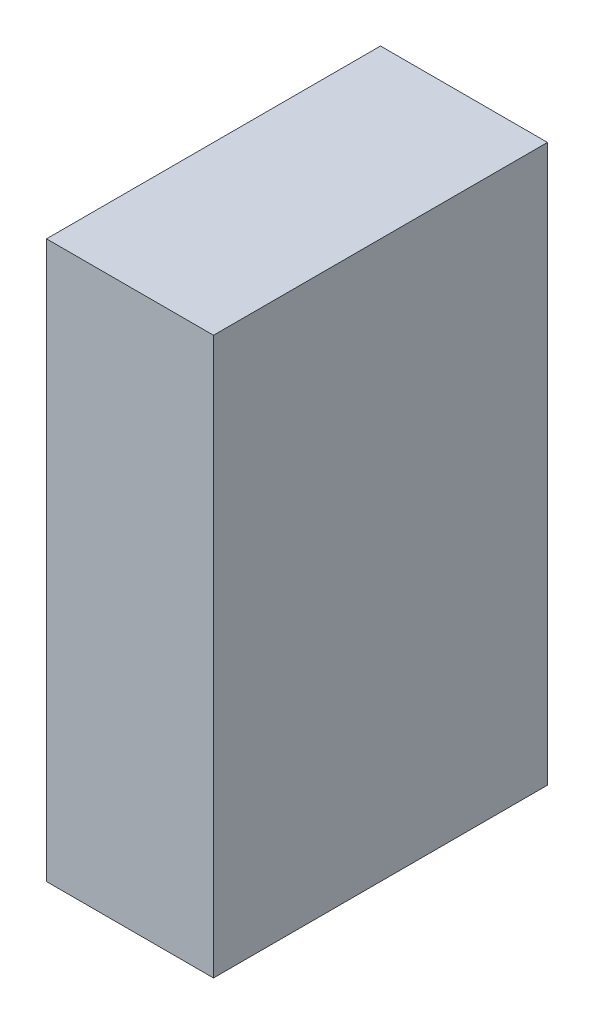
ISO-10303-21;
HEADER;
FILE_DESCRIPTION(('STEP AP214'),'2;1');
FILE_NAME('part.step','',(''),(''),'','','');
FILE_SCHEMA(('AUTOMOTIVE_DESIGN { 1 0 10303 214 1 1 1 1 }'));
ENDSEC;
DATA;
#1=APPLICATION_CONTEXT('core data for automotive mechanical design processes');
#2=APPLICATION_PROTOCOL_DEFINITION('international standard','automotive_design',2000,#1);
#3=PRODUCT_CONTEXT('',#1,'mechanical');
#4=PRODUCT('Part','Part','',(#3));
#5=PRODUCT_RELATED_PRODUCT_CATEGORY('part','',(#4));
#6=PRODUCT_DEFINITION_FORMATION('','',#4);
#7=PRODUCT_DEFINITION_CONTEXT('part definition',#1,'design');
#8=PRODUCT_DEFINITION('design','',#6,#7);
#9=PRODUCT_DEFINITION_SHAPE('','',#8);
#10=(LENGTH_UNIT() NAMED_UNIT(*) SI_UNIT(.MILLI.,.METRE.));
#11=(NAMED_UNIT(*) PLANE_ANGLE_UNIT() SI_UNIT($,.RADIAN.));
#12=(NAMED_UNIT(*) SI_UNIT($,.STERADIAN.) SOLID_ANGLE_UNIT());
#13=UNCERTAINTY_MEASURE_WITH_UNIT(LENGTH_MEASURE(1.E-05),#10,'distance_accuracy_value','');
#14=(GEOMETRIC_REPRESENTATION_CONTEXT(3) GLOBAL_UNCERTAINTY_ASSIGNED_CONTEXT((#13)) GLOBAL_UNIT_ASSIGNED_CONTEXT((#10,
#11,#12)) REPRESENTATION_CONTEXT('',''));
#15=CARTESIAN_POINT('',(0.,0.,0.));
#16=DIRECTION('',(0.,0.,1.));
#17=DIRECTION('',(1.,0.,0.));
#18=AXIS2_PLACEMENT_3D('',#15,#16,#17);
#19=CARTESIAN_POINT('',(-3.,10.,12.));
#20=DIRECTION('',(1.,0.,0.));
#21=DIRECTION('',(0.,0.,-1.));
#22=AXIS2_PLACEMENT_3D('',#19,#20,#21);
#23=PLANE('',#22);
#24=DIRECTION('',(0.,-1.,0.));
#25=VECTOR('',#24,1.);
#26=CARTESIAN_POINT('',(-3.,10.,0.));
#27=LINE('',#26,#25);
#28=CARTESIAN_POINT('',(-3.,10.,0.));
#29=VERTEX_POINT('',#28);
#30=CARTESIAN_POINT('',(-3.,-10.,0.));
#31=VERTEX_POINT('',#30);
#32=EDGE_CURVE('E96',#29,#31,#27,.T.);
#33=ORIENTED_EDGE('',*,*,#32,.T.);
#34=DIRECTION('',(0.,0.,-1.));
#35=VECTOR('',#34,1.);
#36=CARTESIAN_POINT('',(-3.,-10.,12.));
#37=LINE('',#36,#35);
#38=CARTESIAN_POINT('',(-3.,-10.,12.));
#39=VERTEX_POINT('',#38);
#40=EDGE_CURVE('E11',#39,#31,#37,.T.);
#41=ORIENTED_EDGE('',*,*,#40,.F.);
#42=DIRECTION('',(0.,-1.,0.));
#43=VECTOR('',#42,1.);
#44=CARTESIAN_POINT('',(-3.,10.,12.));
#45=LINE('',#44,#43);
#46=CARTESIAN_POINT('',(-3.,10.,12.));
#47=VERTEX_POINT('',#46);
#48=EDGE_CURVE('E84',#47,#39,#45,.T.);
#49=ORIENTED_EDGE('',*,*,#48,.F.);
#50=DIRECTION('',(0.,0.,-1.));
#51=VECTOR('',#50,1.);
#52=CARTESIAN_POINT('',(-3.,10.,12.));
#53=LINE('',#52,#51);
#54=EDGE_CURVE('E92',#47,#29,#53,.T.);
#55=ORIENTED_EDGE('',*,*,#54,.T.);
#56=EDGE_LOOP('',(#33,#41,#49,#55));
#57=FACE_BOUND('',#56,.T.);
#58=ADVANCED_FACE('F33',(#57),#23,.F.);
#59=CARTESIAN_POINT('',(-3.,-10.,12.));
#60=DIRECTION('',(0.,1.,0.));
#61=DIRECTION('',(0.,0.,1.));
#62=AXIS2_PLACEMENT_3D('',#59,#60,#61);
#63=PLANE('',#62);
#64=DIRECTION('',(1.,0.,0.));
#65=VECTOR('',#64,1.);
#66=CARTESIAN_POINT('',(-3.,-10.,0.));
#67=LINE('',#66,#65);
#68=CARTESIAN_POINT('',(3.,-10.,0.));
#69=VERTEX_POINT('',#68);
#70=EDGE_CURVE('E88',#31,#69,#67,.T.);
#71=ORIENTED_EDGE('',*,*,#70,.T.);
#72=DIRECTION('',(0.,0.,-1.));
#73=VECTOR('',#72,1.);
#74=CARTESIAN_POINT('',(3.,-10.,12.));
#75=LINE('',#74,#73);
#76=CARTESIAN_POINT('',(3.,-10.,12.));
#77=VERTEX_POINT('',#76);
#78=EDGE_CURVE('E41',#77,#69,#75,.T.);
#79=ORIENTED_EDGE('',*,*,#78,.F.);
#80=DIRECTION('',(1.,0.,0.));
#81=VECTOR('',#80,1.);
#82=CARTESIAN_POINT('',(-3.,-10.,12.));
#83=LINE('',#82,#81);
#84=EDGE_CURVE('E79',#39,#77,#83,.T.);
#85=ORIENTED_EDGE('',*,*,#84,.F.);
#86=ORIENTED_EDGE('',*,*,#40,.T.);
#87=EDGE_LOOP('',(#71,#79,#85,#86));
#88=FACE_BOUND('',#87,.T.);
#89=ADVANCED_FACE('F87',(#88),#63,.F.);
#90=CARTESIAN_POINT('',(3.,-10.,12.));
#91=DIRECTION('',(-1.,0.,0.));
#92=DIRECTION('',(0.,0.,1.));
#93=AXIS2_PLACEMENT_3D('',#90,#91,#92);
#94=PLANE('',#93);
#95=DIRECTION('',(0.,1.,0.));
#96=VECTOR('',#95,1.);
#97=CARTESIAN_POINT('',(3.,-10.,0.));
#98=LINE('',#97,#96);
#99=CARTESIAN_POINT('',(3.,10.,0.));
#100=VERTEX_POINT('',#99);
#101=EDGE_CURVE('E66',#69,#100,#98,.T.);
#102=ORIENTED_EDGE('',*,*,#101,.T.);
#103=DIRECTION('',(0.,0.,-1.));
#104=VECTOR('',#103,1.);
#105=CARTESIAN_POINT('',(3.,10.,12.));
#106=LINE('',#105,#104);
#107=CARTESIAN_POINT('',(3.,10.,12.));
#108=VERTEX_POINT('',#107);
#109=EDGE_CURVE('E89',#108,#100,#106,.T.);
#110=ORIENTED_EDGE('',*,*,#109,.F.);
#111=DIRECTION('',(0.,1.,0.));
#112=VECTOR('',#111,1.);
#113=CARTESIAN_POINT('',(3.,-10.,12.));
#114=LINE('',#113,#112);
#115=EDGE_CURVE('E82',#77,#108,#114,.T.);
#116=ORIENTED_EDGE('',*,*,#115,.F.);
#117=ORIENTED_EDGE('',*,*,#78,.T.);
#118=EDGE_LOOP('',(#102,#110,#116,#117));
#119=FACE_BOUND('',#118,.T.);
#120=ADVANCED_FACE('F90',(#119),#94,.F.);
#121=CARTESIAN_POINT('',(3.,10.,12.));
#122=DIRECTION('',(0.,-1.,0.));
#123=DIRECTION('',(0.,0.,-1.));
#124=AXIS2_PLACEMENT_3D('',#121,#122,#123);
#125=PLANE('',#124);
#126=DIRECTION('',(-1.,0.,0.));
#127=VECTOR('',#126,1.);
#128=CARTESIAN_POINT('',(3.,10.,0.));
#129=LINE('',#128,#127);
#130=EDGE_CURVE('E72',#100,#29,#129,.T.);
#131=ORIENTED_EDGE('',*,*,#130,.T.);
#132=ORIENTED_EDGE('',*,*,#54,.F.);
#133=DIRECTION('',(-1.,0.,0.));
#134=VECTOR('',#133,1.);
#135=CARTESIAN_POINT('',(3.,10.,12.));
#136=LINE('',#135,#134);
#137=EDGE_CURVE('E49',#108,#47,#136,.T.);
#138=ORIENTED_EDGE('',*,*,#137,.F.);
#139=ORIENTED_EDGE('',*,*,#109,.T.);
#140=EDGE_LOOP('',(#131,#132,#138,#139));
#141=FACE_BOUND('',#140,.T.);
#142=ADVANCED_FACE('F103',(#141),#125,.F.);
#143=CARTESIAN_POINT('',(0.,0.,12.));
#144=DIRECTION('',(0.,0.,1.));
#145=DIRECTION('',(1.,0.,0.));
#146=AXIS2_PLACEMENT_3D('',#143,#144,#145);
#147=PLANE('',#146);
#148=ORIENTED_EDGE('',*,*,#48,.T.);
#149=ORIENTED_EDGE('',*,*,#84,.T.);
#150=ORIENTED_EDGE('',*,*,#115,.T.);
#151=ORIENTED_EDGE('',*,*,#137,.T.);
#152=EDGE_LOOP('',(#148,#149,#150,#151));
#153=FACE_BOUND('',#152,.T.);
#154=ADVANCED_FACE('F80',(#153),#147,.T.);
#155=CARTESIAN_POINT('',(0.,0.,0.));
#156=DIRECTION('',(0.,0.,1.));
#157=DIRECTION('',(1.,0.,0.));
#158=AXIS2_PLACEMENT_3D('',#155,#156,#157);
#159=PLANE('',#158);
#160=ORIENTED_EDGE('',*,*,#32,.F.);
#161=ORIENTED_EDGE('',*,*,#130,.F.);
#162=ORIENTED_EDGE('',*,*,#101,.F.);
#163=ORIENTED_EDGE('',*,*,#70,.F.);
#164=EDGE_LOOP('',(#160,#161,#162,#163));
#165=FACE_BOUND('',#164,.T.);
#166=ADVANCED_FACE('F106',(#165),#159,.F.);
#167=CLOSED_SHELL('',(#58,#89,#120,#142,#154,#166));
#168=MANIFOLD_SOLID_BREP('B2',#167);
#169=ADVANCED_BREP_SHAPE_REPRESENTATION('',(#18,#168),#14);
#170=SHAPE_DEFINITION_REPRESENTATION(#9,#169);
ENDSEC;
END-ISO-10303-21;
